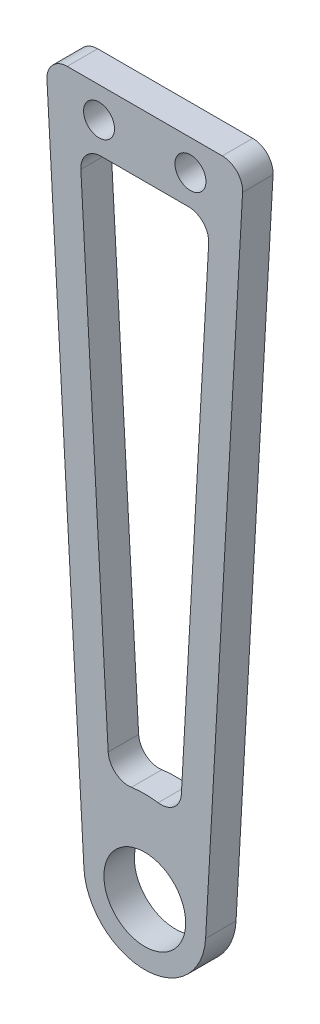
ISO-10303-21;
HEADER;
FILE_DESCRIPTION(('STEP AP214'),'2;1');
FILE_NAME('part.step','',(''),(''),'','','');
FILE_SCHEMA(('AUTOMOTIVE_DESIGN { 1 0 10303 214 1 1 1 1 }'));
ENDSEC;
DATA;
#1=APPLICATION_CONTEXT('core data for automotive mechanical design processes');
#2=APPLICATION_PROTOCOL_DEFINITION('international standard','automotive_design',2000,#1);
#3=PRODUCT_CONTEXT('',#1,'mechanical');
#4=PRODUCT('Part','Part','',(#3));
#5=PRODUCT_RELATED_PRODUCT_CATEGORY('part','',(#4));
#6=PRODUCT_DEFINITION_FORMATION('','',#4);
#7=PRODUCT_DEFINITION_CONTEXT('part definition',#1,'design');
#8=PRODUCT_DEFINITION('design','',#6,#7);
#9=PRODUCT_DEFINITION_SHAPE('','',#8);
#10=(LENGTH_UNIT() NAMED_UNIT(*) SI_UNIT(.MILLI.,.METRE.));
#11=(NAMED_UNIT(*) PLANE_ANGLE_UNIT() SI_UNIT($,.RADIAN.));
#12=(NAMED_UNIT(*) SI_UNIT($,.STERADIAN.) SOLID_ANGLE_UNIT());
#13=UNCERTAINTY_MEASURE_WITH_UNIT(LENGTH_MEASURE(1.E-05),#10,'distance_accuracy_value','');
#14=(GEOMETRIC_REPRESENTATION_CONTEXT(3) GLOBAL_UNCERTAINTY_ASSIGNED_CONTEXT((#13)) GLOBAL_UNIT_ASSIGNED_CONTEXT((#10,
#11,#12)) REPRESENTATION_CONTEXT('',''));
#15=CARTESIAN_POINT('',(0.,0.,0.));
#16=DIRECTION('',(0.,0.,1.));
#17=DIRECTION('',(1.,0.,0.));
#18=AXIS2_PLACEMENT_3D('',#15,#16,#17);
#19=CARTESIAN_POINT('',(7.98764478027175,-0.444444444444444,3.));
#20=DIRECTION('',(0.998455597533968,-0.0555555555555554,0.));
#21=DIRECTION('',(0.0555555555555555,0.998455597533968,0.));
#22=AXIS2_PLACEMENT_3D('',#19,#20,#21);
#23=PLANE('',#22);
#24=DIRECTION('',(-0.0555555555555555,-0.998455597533968,0.));
#25=VECTOR('',#24,1.);
#26=CARTESIAN_POINT('',(7.98764478027175,-0.444444444444444,3.));
#27=LINE('',#26,#25);
#28=CARTESIAN_POINT('',(6.29384167167906,-30.885813952551,3.));
#29=VERTEX_POINT('',#28);
#30=CARTESIAN_POINT('',(3.6039474120521,-79.2291335979336,3.));
#31=VERTEX_POINT('',#30);
#32=EDGE_CURVE('E273',#29,#31,#27,.T.);
#33=ORIENTED_EDGE('',*,*,#32,.F.);
#34=DIRECTION('',(0.,0.,1.));
#35=VECTOR('',#34,1.);
#36=CARTESIAN_POINT('',(6.29384167167906,-30.885813952551,3.));
#37=LINE('',#36,#35);
#38=CARTESIAN_POINT('',(6.29384167167906,-30.885813952551,0.));
#39=VERTEX_POINT('',#38);
#40=EDGE_CURVE('E223',#29,#39,#37,.F.);
#41=ORIENTED_EDGE('',*,*,#40,.T.);
#42=DIRECTION('',(-0.0555555555555555,-0.998455597533968,0.));
#43=VECTOR('',#42,1.);
#44=CARTESIAN_POINT('',(7.98764478027175,-0.444444444444444,0.));
#45=LINE('',#44,#43);
#46=CARTESIAN_POINT('',(3.6039474120521,-79.2291335979336,0.));
#47=VERTEX_POINT('',#46);
#48=EDGE_CURVE('E255',#39,#47,#45,.T.);
#49=ORIENTED_EDGE('',*,*,#48,.T.);
#50=DIRECTION('',(0.,0.,1.));
#51=VECTOR('',#50,1.);
#52=CARTESIAN_POINT('',(3.6039474120521,-79.2291335979336,3.));
#53=LINE('',#52,#51);
#54=EDGE_CURVE('E220',#47,#31,#53,.T.);
#55=ORIENTED_EDGE('',*,*,#54,.T.);
#56=EDGE_LOOP('',(#33,#41,#49,#55));
#57=FACE_BOUND('',#56,.T.);
#58=ADVANCED_FACE('F41',(#57),#23,.F.);
#59=CARTESIAN_POINT('',(-7.98764478027175,-0.444444444444445,3.));
#60=DIRECTION('',(0.998455597533968,0.0555555555555557,0.));
#61=DIRECTION('',(-0.0555555555555557,0.998455597533968,0.));
#62=AXIS2_PLACEMENT_3D('',#59,#60,#61);
#63=PLANE('',#62);
#64=DIRECTION('',(0.0555555555555557,-0.998455597533968,0.));
#65=VECTOR('',#64,1.);
#66=CARTESIAN_POINT('',(-7.98764478027175,-0.444444444444445,0.));
#67=LINE('',#66,#65);
#68=CARTESIAN_POINT('',(-6.29384167167905,-30.885813952551,0.));
#69=VERTEX_POINT('',#68);
#70=CARTESIAN_POINT('',(-3.60394741205208,-79.2291335979336,0.));
#71=VERTEX_POINT('',#70);
#72=EDGE_CURVE('E299',#69,#71,#67,.T.);
#73=ORIENTED_EDGE('',*,*,#72,.F.);
#74=DIRECTION('',(0.,0.,1.));
#75=VECTOR('',#74,1.);
#76=CARTESIAN_POINT('',(-6.29384167167905,-30.885813952551,3.));
#77=LINE('',#76,#75);
#78=CARTESIAN_POINT('',(-6.29384167167905,-30.885813952551,3.));
#79=VERTEX_POINT('',#78);
#80=EDGE_CURVE('E210',#69,#79,#77,.T.);
#81=ORIENTED_EDGE('',*,*,#80,.T.);
#82=DIRECTION('',(0.0555555555555557,-0.998455597533968,0.));
#83=VECTOR('',#82,1.);
#84=CARTESIAN_POINT('',(-7.98764478027175,-0.444444444444445,3.));
#85=LINE('',#84,#83);
#86=CARTESIAN_POINT('',(-3.60394741205208,-79.2291335979336,3.));
#87=VERTEX_POINT('',#86);
#88=EDGE_CURVE('E278',#79,#87,#85,.T.);
#89=ORIENTED_EDGE('',*,*,#88,.T.);
#90=DIRECTION('',(0.,0.,-1.));
#91=VECTOR('',#90,1.);
#92=CARTESIAN_POINT('',(-3.60394741205208,-79.2291335979336,3.));
#93=LINE('',#92,#91);
#94=EDGE_CURVE('E206',#87,#71,#93,.T.);
#95=ORIENTED_EDGE('',*,*,#94,.T.);
#96=EDGE_LOOP('',(#73,#81,#89,#95));
#97=FACE_BOUND('',#96,.T.);
#98=ADVANCED_FACE('F323',(#97),#63,.T.);
#99=CARTESIAN_POINT('',(0.,-90.,3.));
#100=DIRECTION('',(0.,0.,-1.));
#101=DIRECTION('',(-1.,0.,0.));
#102=AXIS2_PLACEMENT_3D('',#99,#100,#101);
#103=CYLINDRICAL_SURFACE('',#102,9.00000000000001);
#104=CARTESIAN_POINT('',(0.,-90.,0.));
#105=DIRECTION('',(0.,0.,1.));
#106=DIRECTION('',(1.,0.,0.));
#107=AXIS2_PLACEMENT_3D('',#104,#105,#106);
#108=CIRCLE('',#107,9.00000000000001);
#109=CARTESIAN_POINT('',(1.31484781389614,-81.0965638528547,0.));
#110=VERTEX_POINT('',#109);
#111=CARTESIAN_POINT('',(-1.31484781389612,-81.0965638528547,0.));
#112=VERTEX_POINT('',#111);
#113=EDGE_CURVE('E258',#110,#112,#108,.T.);
#114=ORIENTED_EDGE('',*,*,#113,.T.);
#115=DIRECTION('',(0.,0.,-1.));
#116=VECTOR('',#115,1.);
#117=CARTESIAN_POINT('',(-1.31484781389612,-81.0965638528547,3.));
#118=LINE('',#117,#116);
#119=CARTESIAN_POINT('',(-1.31484781389612,-81.0965638528547,3.));
#120=VERTEX_POINT('',#119);
#121=EDGE_CURVE('E230',#112,#120,#118,.F.);
#122=ORIENTED_EDGE('',*,*,#121,.T.);
#123=CARTESIAN_POINT('',(0.,-90.,3.));
#124=DIRECTION('',(0.,0.,1.));
#125=DIRECTION('',(1.,0.,0.));
#126=AXIS2_PLACEMENT_3D('',#123,#124,#125);
#127=CIRCLE('',#126,9.00000000000001);
#128=CARTESIAN_POINT('',(1.31484781389614,-81.0965638528547,3.));
#129=VERTEX_POINT('',#128);
#130=EDGE_CURVE('E272',#129,#120,#127,.T.);
#131=ORIENTED_EDGE('',*,*,#130,.F.);
#132=DIRECTION('',(0.,0.,-1.));
#133=VECTOR('',#132,1.);
#134=CARTESIAN_POINT('',(1.31484781389614,-81.0965638528547,3.));
#135=LINE('',#134,#133);
#136=EDGE_CURVE('E226',#129,#110,#135,.T.);
#137=ORIENTED_EDGE('',*,*,#136,.T.);
#138=EDGE_LOOP('',(#114,#122,#131,#137));
#139=FACE_BOUND('',#138,.T.);
#140=ADVANCED_FACE('F275',(#139),#103,.T.);
#141=CARTESIAN_POINT('',(-10.9830115728737,-0.611111111111113,3.));
#142=DIRECTION('',(0.998455597533968,0.0555555555555557,0.));
#143=DIRECTION('',(-0.0555555555555557,0.998455597533968,0.));
#144=AXIS2_PLACEMENT_3D('',#141,#142,#143);
#145=PLANE('',#144);
#146=DIRECTION('',(0.0555555555555557,-0.998455597533968,0.));
#147=VECTOR('',#146,1.);
#148=CARTESIAN_POINT('',(-10.9830115728737,-0.611111111111113,3.));
#149=LINE('',#148,#147);
#150=CARTESIAN_POINT('',(-9.632330976127,-24.885813952551,3.));
#151=VERTEX_POINT('',#150);
#152=CARTESIAN_POINT('',(-5.9907335852038,-90.3333333333333,3.));
#153=VERTEX_POINT('',#152);
#154=EDGE_CURVE('E145',#151,#153,#149,.T.);
#155=ORIENTED_EDGE('',*,*,#154,.F.);
#156=DIRECTION('',(0.,0.,-1.));
#157=VECTOR('',#156,1.);
#158=CARTESIAN_POINT('',(-9.632330976127,-24.885813952551,0.));
#159=LINE('',#158,#157);
#160=CARTESIAN_POINT('',(-9.632330976127,-24.885813952551,0.));
#161=VERTEX_POINT('',#160);
#162=EDGE_CURVE('E203',#151,#161,#159,.T.);
#163=ORIENTED_EDGE('',*,*,#162,.T.);
#164=DIRECTION('',(0.0555555555555557,-0.998455597533968,0.));
#165=VECTOR('',#164,1.);
#166=CARTESIAN_POINT('',(-10.9830115728737,-0.611111111111113,0.));
#167=LINE('',#166,#165);
#168=CARTESIAN_POINT('',(-5.9907335852038,-90.3333333333333,0.));
#169=VERTEX_POINT('',#168);
#170=EDGE_CURVE('E173',#161,#169,#167,.T.);
#171=ORIENTED_EDGE('',*,*,#170,.T.);
#172=DIRECTION('',(0.,0.,-1.));
#173=VECTOR('',#172,1.);
#174=CARTESIAN_POINT('',(-5.9907335852038,-90.3333333333333,3.));
#175=LINE('',#174,#173);
#176=EDGE_CURVE('E165',#153,#169,#175,.T.);
#177=ORIENTED_EDGE('',*,*,#176,.F.);
#178=EDGE_LOOP('',(#155,#163,#171,#177));
#179=FACE_BOUND('',#178,.T.);
#180=ADVANCED_FACE('F171',(#179),#145,.F.);
#181=CARTESIAN_POINT('',(0.,-90.,3.));
#182=DIRECTION('',(0.,0.,-1.));
#183=DIRECTION('',(-1.,0.,0.));
#184=AXIS2_PLACEMENT_3D('',#181,#182,#183);
#185=CYLINDRICAL_SURFACE('',#184,6.);
#186=CARTESIAN_POINT('',(0.,-90.,0.));
#187=DIRECTION('',(0.,0.,1.));
#188=DIRECTION('',(1.,0.,0.));
#189=AXIS2_PLACEMENT_3D('',#186,#187,#188);
#190=CIRCLE('',#189,6.);
#191=CARTESIAN_POINT('',(5.99073358520382,-90.3333333333333,0.));
#192=VERTEX_POINT('',#191);
#193=EDGE_CURVE('E291',#169,#192,#190,.T.);
#194=ORIENTED_EDGE('',*,*,#193,.T.);
#195=DIRECTION('',(0.,0.,-1.));
#196=VECTOR('',#195,1.);
#197=CARTESIAN_POINT('',(5.99073358520382,-90.3333333333333,3.));
#198=LINE('',#197,#196);
#199=CARTESIAN_POINT('',(5.99073358520382,-90.3333333333333,3.));
#200=VERTEX_POINT('',#199);
#201=EDGE_CURVE('E167',#200,#192,#198,.T.);
#202=ORIENTED_EDGE('',*,*,#201,.F.);
#203=CARTESIAN_POINT('',(0.,-90.,3.));
#204=DIRECTION('',(0.,0.,1.));
#205=DIRECTION('',(1.,0.,0.));
#206=AXIS2_PLACEMENT_3D('',#203,#204,#205);
#207=CIRCLE('',#206,6.);
#208=EDGE_CURVE('E149',#153,#200,#207,.T.);
#209=ORIENTED_EDGE('',*,*,#208,.F.);
#210=ORIENTED_EDGE('',*,*,#176,.T.);
#211=EDGE_LOOP('',(#194,#202,#209,#210));
#212=FACE_BOUND('',#211,.T.);
#213=ADVANCED_FACE('F164',(#212),#185,.T.);
#214=CARTESIAN_POINT('',(10.9830115728737,-0.61111111111111,3.));
#215=DIRECTION('',(0.998455597533968,-0.0555555555555555,0.));
#216=DIRECTION('',(0.0555555555555555,0.998455597533968,0.));
#217=AXIS2_PLACEMENT_3D('',#214,#215,#216);
#218=PLANE('',#217);
#219=DIRECTION('',(-0.0555555555555555,-0.998455597533968,0.));
#220=VECTOR('',#219,1.);
#221=CARTESIAN_POINT('',(10.9830115728737,-0.61111111111111,0.));
#222=LINE('',#221,#220);
#223=CARTESIAN_POINT('',(9.632330976127,-24.885813952551,0.));
#224=VERTEX_POINT('',#223);
#225=EDGE_CURVE('E267',#224,#192,#222,.T.);
#226=ORIENTED_EDGE('',*,*,#225,.F.);
#227=DIRECTION('',(0.,0.,-1.));
#228=VECTOR('',#227,1.);
#229=CARTESIAN_POINT('',(9.632330976127,-24.885813952551,3.));
#230=LINE('',#229,#228);
#231=CARTESIAN_POINT('',(9.632330976127,-24.885813952551,3.));
#232=VERTEX_POINT('',#231);
#233=EDGE_CURVE('E195',#224,#232,#230,.F.);
#234=ORIENTED_EDGE('',*,*,#233,.T.);
#235=DIRECTION('',(-0.0555555555555555,-0.998455597533968,0.));
#236=VECTOR('',#235,1.);
#237=CARTESIAN_POINT('',(10.9830115728737,-0.61111111111111,3.));
#238=LINE('',#237,#236);
#239=EDGE_CURVE('E169',#232,#200,#238,.T.);
#240=ORIENTED_EDGE('',*,*,#239,.T.);
#241=ORIENTED_EDGE('',*,*,#201,.T.);
#242=EDGE_LOOP('',(#226,#234,#240,#241));
#243=FACE_BOUND('',#242,.T.);
#244=ADVANCED_FACE('F310',(#243),#218,.T.);
#245=CARTESIAN_POINT('',(0.,-90.,3.));
#246=DIRECTION('',(0.,0.,-1.));
#247=DIRECTION('',(-1.,0.,0.));
#248=AXIS2_PLACEMENT_3D('',#245,#246,#247);
#249=CYLINDRICAL_SURFACE('',#248,4.025);
#250=CARTESIAN_POINT('',(0.,-90.,3.));
#251=DIRECTION('',(0.,0.,1.));
#252=DIRECTION('',(1.,0.,0.));
#253=AXIS2_PLACEMENT_3D('',#250,#251,#252);
#254=CIRCLE('',#253,4.025);
#255=CARTESIAN_POINT('',(4.02500000000001,-90.,3.));
#256=VERTEX_POINT('',#255);
#257=EDGE_CURVE('E182',#256,#256,#254,.T.);
#258=ORIENTED_EDGE('',*,*,#257,.T.);
#259=EDGE_LOOP('',(#258));
#260=FACE_BOUND('',#259,.T.);
#261=CARTESIAN_POINT('',(0.,-90.,0.));
#262=DIRECTION('',(0.,0.,1.));
#263=DIRECTION('',(1.,0.,0.));
#264=AXIS2_PLACEMENT_3D('',#261,#262,#263);
#265=CIRCLE('',#264,4.025);
#266=CARTESIAN_POINT('',(4.02500000000001,-90.,0.));
#267=VERTEX_POINT('',#266);
#268=EDGE_CURVE('E159',#267,#267,#265,.T.);
#269=ORIENTED_EDGE('',*,*,#268,.F.);
#270=EDGE_LOOP('',(#269));
#271=FACE_BOUND('',#270,.T.);
#272=ADVANCED_FACE('F308',(#260,#271),#249,.F.);
#273=CARTESIAN_POINT('',(0.,0.,3.));
#274=DIRECTION('',(0.,0.,1.));
#275=DIRECTION('',(1.,0.,0.));
#276=AXIS2_PLACEMENT_3D('',#273,#274,#275);
#277=PLANE('',#276);
#278=ORIENTED_EDGE('',*,*,#239,.F.);
#279=CARTESIAN_POINT('',(7.63541978105906,-24.7747028414399,3.));
#280=DIRECTION('',(0.,0.,1.));
#281=DIRECTION('',(1.,0.,0.));
#282=AXIS2_PLACEMENT_3D('',#279,#280,#281);
#283=CIRCLE('',#282,2.);
#284=CARTESIAN_POINT('',(7.63541978105906,-22.7747028414399,3.));
#285=VERTEX_POINT('',#284);
#286=EDGE_CURVE('E200',#232,#285,#283,.T.);
#287=ORIENTED_EDGE('',*,*,#286,.T.);
#288=DIRECTION('',(-1.,0.,0.));
#289=VECTOR('',#288,1.);
#290=CARTESIAN_POINT('',(-6.7451559665396,-22.7747028414399,3.));
#291=LINE('',#290,#289);
#292=CARTESIAN_POINT('',(-7.63541978105906,-22.7747028414399,3.));
#293=VERTEX_POINT('',#292);
#294=EDGE_CURVE('E369',#285,#293,#291,.T.);
#295=ORIENTED_EDGE('',*,*,#294,.T.);
#296=CARTESIAN_POINT('',(-7.63541978105906,-24.7747028414399,3.));
#297=DIRECTION('',(0.,0.,1.));
#298=DIRECTION('',(1.,0.,0.));
#299=AXIS2_PLACEMENT_3D('',#296,#297,#298);
#300=CIRCLE('',#299,2.);
#301=EDGE_CURVE('E153',#293,#151,#300,.T.);
#302=ORIENTED_EDGE('',*,*,#301,.T.);
#303=ORIENTED_EDGE('',*,*,#154,.T.);
#304=ORIENTED_EDGE('',*,*,#208,.T.);
#305=EDGE_LOOP('',(#278,#287,#295,#302,#303,#304));
#306=FACE_BOUND('',#305,.T.);
#307=ORIENTED_EDGE('',*,*,#88,.F.);
#308=CARTESIAN_POINT('',(-4.29693047661111,-30.7747028414399,3.));
#309=DIRECTION('',(0.,0.,1.));
#310=DIRECTION('',(1.,0.,0.));
#311=AXIS2_PLACEMENT_3D('',#308,#309,#310);
#312=CIRCLE('',#311,2.);
#313=CARTESIAN_POINT('',(-4.29693047661111,-28.7747028414399,3.));
#314=VERTEX_POINT('',#313);
#315=EDGE_CURVE('E65',#79,#314,#312,.F.);
#316=ORIENTED_EDGE('',*,*,#315,.T.);
#317=DIRECTION('',(1.,0.,0.));
#318=VECTOR('',#317,1.);
#319=CARTESIAN_POINT('',(-6.41130703609481,-28.7747028414399,3.));
#320=LINE('',#319,#318);
#321=CARTESIAN_POINT('',(4.29693047661112,-28.7747028414399,3.));
#322=VERTEX_POINT('',#321);
#323=EDGE_CURVE('E364',#314,#322,#320,.T.);
#324=ORIENTED_EDGE('',*,*,#323,.T.);
#325=CARTESIAN_POINT('',(4.29693047661112,-30.7747028414399,3.));
#326=DIRECTION('',(0.,0.,1.));
#327=DIRECTION('',(1.,0.,0.));
#328=AXIS2_PLACEMENT_3D('',#325,#326,#327);
#329=CIRCLE('',#328,2.);
#330=EDGE_CURVE('E238',#322,#29,#329,.F.);
#331=ORIENTED_EDGE('',*,*,#330,.T.);
#332=ORIENTED_EDGE('',*,*,#32,.T.);
#333=CARTESIAN_POINT('',(1.60703621698416,-79.1180224868225,3.));
#334=DIRECTION('',(0.,0.,1.));
#335=DIRECTION('',(1.,0.,0.));
#336=AXIS2_PLACEMENT_3D('',#333,#334,#335);
#337=CIRCLE('',#336,2.);
#338=EDGE_CURVE('E11',#31,#129,#337,.F.);
#339=ORIENTED_EDGE('',*,*,#338,.T.);
#340=ORIENTED_EDGE('',*,*,#130,.T.);
#341=CARTESIAN_POINT('',(-1.60703621698414,-79.1180224868225,3.));
#342=DIRECTION('',(0.,0.,1.));
#343=DIRECTION('',(1.,0.,0.));
#344=AXIS2_PLACEMENT_3D('',#341,#342,#343);
#345=CIRCLE('',#344,2.);
#346=EDGE_CURVE('E57',#120,#87,#345,.F.);
#347=ORIENTED_EDGE('',*,*,#346,.T.);
#348=EDGE_LOOP('',(#307,#316,#324,#331,#332,#339,#340,#347));
#349=FACE_BOUND('',#348,.T.);
#350=ORIENTED_EDGE('',*,*,#257,.F.);
#351=EDGE_LOOP('',(#350));
#352=FACE_BOUND('',#351,.T.);
#353=CARTESIAN_POINT('',(4.5,-25.7747028414399,3.));
#354=DIRECTION('',(0.,0.,1.));
#355=DIRECTION('',(-1.,0.,0.));
#356=AXIS2_PLACEMENT_3D('',#353,#354,#355);
#357=CIRCLE('',#356,1.525);
#358=CARTESIAN_POINT('',(2.97500000000001,-25.7747028414399,3.));
#359=VERTEX_POINT('',#358);
#360=EDGE_CURVE('E377',#359,#359,#357,.T.);
#361=ORIENTED_EDGE('',*,*,#360,.F.);
#362=EDGE_LOOP('',(#361));
#363=FACE_BOUND('',#362,.T.);
#364=CARTESIAN_POINT('',(-4.5,-25.7747028414399,3.));
#365=DIRECTION('',(0.,0.,1.));
#366=DIRECTION('',(1.,0.,0.));
#367=AXIS2_PLACEMENT_3D('',#364,#365,#366);
#368=CIRCLE('',#367,1.525);
#369=CARTESIAN_POINT('',(-2.975,-25.7747028414399,3.));
#370=VERTEX_POINT('',#369);
#371=EDGE_CURVE('E370',#370,#370,#368,.T.);
#372=ORIENTED_EDGE('',*,*,#371,.F.);
#373=EDGE_LOOP('',(#372));
#374=FACE_BOUND('',#373,.T.);
#375=ADVANCED_FACE('F148',(#306,#349,#352,#363,#374),#277,.T.);
#376=CARTESIAN_POINT('',(0.,0.,0.));
#377=DIRECTION('',(0.,0.,1.));
#378=DIRECTION('',(1.,0.,0.));
#379=AXIS2_PLACEMENT_3D('',#376,#377,#378);
#380=PLANE('',#379);
#381=ORIENTED_EDGE('',*,*,#48,.F.);
#382=CARTESIAN_POINT('',(4.29693047661112,-30.7747028414399,0.));
#383=DIRECTION('',(0.,0.,1.));
#384=DIRECTION('',(1.,0.,0.));
#385=AXIS2_PLACEMENT_3D('',#382,#383,#384);
#386=CIRCLE('',#385,2.);
#387=CARTESIAN_POINT('',(4.29693047661112,-28.7747028414399,0.));
#388=VERTEX_POINT('',#387);
#389=EDGE_CURVE('E241',#39,#388,#386,.T.);
#390=ORIENTED_EDGE('',*,*,#389,.T.);
#391=DIRECTION('',(-1.,0.,0.));
#392=VECTOR('',#391,1.);
#393=CARTESIAN_POINT('',(-6.41130703609481,-28.7747028414399,0.));
#394=LINE('',#393,#392);
#395=CARTESIAN_POINT('',(-4.29693047661111,-28.7747028414399,0.));
#396=VERTEX_POINT('',#395);
#397=EDGE_CURVE('E361',#388,#396,#394,.T.);
#398=ORIENTED_EDGE('',*,*,#397,.T.);
#399=CARTESIAN_POINT('',(-4.29693047661111,-30.7747028414399,0.));
#400=DIRECTION('',(0.,0.,1.));
#401=DIRECTION('',(1.,0.,0.));
#402=AXIS2_PLACEMENT_3D('',#399,#400,#401);
#403=CIRCLE('',#402,2.);
#404=EDGE_CURVE('E235',#396,#69,#403,.T.);
#405=ORIENTED_EDGE('',*,*,#404,.T.);
#406=ORIENTED_EDGE('',*,*,#72,.T.);
#407=CARTESIAN_POINT('',(-1.60703621698414,-79.1180224868225,0.));
#408=DIRECTION('',(0.,0.,1.));
#409=DIRECTION('',(1.,0.,0.));
#410=AXIS2_PLACEMENT_3D('',#407,#408,#409);
#411=CIRCLE('',#410,2.);
#412=EDGE_CURVE('E244',#71,#112,#411,.T.);
#413=ORIENTED_EDGE('',*,*,#412,.T.);
#414=ORIENTED_EDGE('',*,*,#113,.F.);
#415=CARTESIAN_POINT('',(1.60703621698416,-79.1180224868225,0.));
#416=DIRECTION('',(0.,0.,1.));
#417=DIRECTION('',(1.,0.,0.));
#418=AXIS2_PLACEMENT_3D('',#415,#416,#417);
#419=CIRCLE('',#418,2.);
#420=EDGE_CURVE('E50',#110,#47,#419,.T.);
#421=ORIENTED_EDGE('',*,*,#420,.T.);
#422=EDGE_LOOP('',(#381,#390,#398,#405,#406,#413,#414,#421));
#423=FACE_BOUND('',#422,.T.);
#424=DIRECTION('',(1.,0.,0.));
#425=VECTOR('',#424,1.);
#426=CARTESIAN_POINT('',(-6.7451559665396,-22.7747028414399,0.));
#427=LINE('',#426,#425);
#428=CARTESIAN_POINT('',(-7.63541978105906,-22.7747028414399,0.));
#429=VERTEX_POINT('',#428);
#430=CARTESIAN_POINT('',(7.63541978105906,-22.7747028414399,0.));
#431=VERTEX_POINT('',#430);
#432=EDGE_CURVE('E374',#429,#431,#427,.T.);
#433=ORIENTED_EDGE('',*,*,#432,.T.);
#434=CARTESIAN_POINT('',(7.63541978105906,-24.7747028414399,0.));
#435=DIRECTION('',(0.,0.,1.));
#436=DIRECTION('',(1.,0.,0.));
#437=AXIS2_PLACEMENT_3D('',#434,#435,#436);
#438=CIRCLE('',#437,2.);
#439=EDGE_CURVE('E192',#431,#224,#438,.F.);
#440=ORIENTED_EDGE('',*,*,#439,.T.);
#441=ORIENTED_EDGE('',*,*,#225,.T.);
#442=ORIENTED_EDGE('',*,*,#193,.F.);
#443=ORIENTED_EDGE('',*,*,#170,.F.);
#444=CARTESIAN_POINT('',(-7.63541978105906,-24.7747028414399,0.));
#445=DIRECTION('',(0.,0.,1.));
#446=DIRECTION('',(1.,0.,0.));
#447=AXIS2_PLACEMENT_3D('',#444,#445,#446);
#448=CIRCLE('',#447,2.);
#449=EDGE_CURVE('E189',#161,#429,#448,.F.);
#450=ORIENTED_EDGE('',*,*,#449,.T.);
#451=EDGE_LOOP('',(#433,#440,#441,#442,#443,#450));
#452=FACE_BOUND('',#451,.T.);
#453=ORIENTED_EDGE('',*,*,#268,.T.);
#454=EDGE_LOOP('',(#453));
#455=FACE_BOUND('',#454,.T.);
#456=CARTESIAN_POINT('',(4.5,-25.7747028414399,0.));
#457=DIRECTION('',(0.,0.,1.));
#458=DIRECTION('',(1.,0.,0.));
#459=AXIS2_PLACEMENT_3D('',#456,#457,#458);
#460=CIRCLE('',#459,1.525);
#461=CARTESIAN_POINT('',(6.025,-25.7747028414399,0.));
#462=VERTEX_POINT('',#461);
#463=EDGE_CURVE('E381',#462,#462,#460,.F.);
#464=ORIENTED_EDGE('',*,*,#463,.F.);
#465=EDGE_LOOP('',(#464));
#466=FACE_BOUND('',#465,.T.);
#467=CARTESIAN_POINT('',(-4.5,-25.7747028414399,0.));
#468=DIRECTION('',(0.,0.,1.));
#469=DIRECTION('',(1.,0.,0.));
#470=AXIS2_PLACEMENT_3D('',#467,#468,#469);
#471=CIRCLE('',#470,1.525);
#472=CARTESIAN_POINT('',(-2.975,-25.7747028414399,0.));
#473=VERTEX_POINT('',#472);
#474=EDGE_CURVE('E292',#473,#473,#471,.F.);
#475=ORIENTED_EDGE('',*,*,#474,.F.);
#476=EDGE_LOOP('',(#475));
#477=FACE_BOUND('',#476,.T.);
#478=ADVANCED_FACE('F253',(#423,#452,#455,#466,#477),#380,.F.);
#479=CARTESIAN_POINT('',(-6.41130703609481,-28.7747028414399,-14.7644341595531));
#480=DIRECTION('',(0.,-1.,0.));
#481=DIRECTION('',(0.,0.,-1.));
#482=AXIS2_PLACEMENT_3D('',#479,#480,#481);
#483=PLANE('',#482);
#484=ORIENTED_EDGE('',*,*,#323,.F.);
#485=DIRECTION('',(0.,0.,1.));
#486=VECTOR('',#485,1.);
#487=CARTESIAN_POINT('',(-4.29693047661111,-28.7747028414399,0.));
#488=LINE('',#487,#486);
#489=EDGE_CURVE('E217',#314,#396,#488,.F.);
#490=ORIENTED_EDGE('',*,*,#489,.T.);
#491=ORIENTED_EDGE('',*,*,#397,.F.);
#492=DIRECTION('',(0.,0.,1.));
#493=VECTOR('',#492,1.);
#494=CARTESIAN_POINT('',(4.29693047661112,-28.7747028414399,-14.7644341595531));
#495=LINE('',#494,#493);
#496=EDGE_CURVE('E213',#388,#322,#495,.T.);
#497=ORIENTED_EDGE('',*,*,#496,.T.);
#498=EDGE_LOOP('',(#484,#490,#491,#497));
#499=FACE_BOUND('',#498,.T.);
#500=ADVANCED_FACE('F366',(#499),#483,.T.);
#501=CARTESIAN_POINT('',(-6.7451559665396,-22.7747028414399,-14.7644341595531));
#502=DIRECTION('',(0.,1.,0.));
#503=DIRECTION('',(0.,0.,1.));
#504=AXIS2_PLACEMENT_3D('',#501,#502,#503);
#505=PLANE('',#504);
#506=ORIENTED_EDGE('',*,*,#294,.F.);
#507=DIRECTION('',(0.,0.,-1.));
#508=VECTOR('',#507,1.);
#509=CARTESIAN_POINT('',(7.63541978105906,-22.7747028414399,-14.7644341595531));
#510=LINE('',#509,#508);
#511=EDGE_CURVE('E180',#285,#431,#510,.T.);
#512=ORIENTED_EDGE('',*,*,#511,.T.);
#513=ORIENTED_EDGE('',*,*,#432,.F.);
#514=DIRECTION('',(0.,0.,-1.));
#515=VECTOR('',#514,1.);
#516=CARTESIAN_POINT('',(-7.63541978105906,-22.7747028414399,3.));
#517=LINE('',#516,#515);
#518=EDGE_CURVE('E176',#429,#293,#517,.F.);
#519=ORIENTED_EDGE('',*,*,#518,.T.);
#520=EDGE_LOOP('',(#506,#512,#513,#519));
#521=FACE_BOUND('',#520,.T.);
#522=ADVANCED_FACE('F393',(#521),#505,.T.);
#523=CARTESIAN_POINT('',(-4.5,-25.7747028414399,-14.7644341595531));
#524=DIRECTION('',(0.,0.,1.));
#525=DIRECTION('',(1.,0.,0.));
#526=AXIS2_PLACEMENT_3D('',#523,#524,#525);
#527=CYLINDRICAL_SURFACE('',#526,1.525);
#528=ORIENTED_EDGE('',*,*,#474,.T.);
#529=EDGE_LOOP('',(#528));
#530=FACE_BOUND('',#529,.T.);
#531=ORIENTED_EDGE('',*,*,#371,.T.);
#532=EDGE_LOOP('',(#531));
#533=FACE_BOUND('',#532,.T.);
#534=ADVANCED_FACE('F408',(#530,#533),#527,.F.);
#535=CARTESIAN_POINT('',(4.5,-25.7747028414399,-14.7644341595531));
#536=DIRECTION('',(0.,0.,1.));
#537=DIRECTION('',(1.,0.,0.));
#538=AXIS2_PLACEMENT_3D('',#535,#536,#537);
#539=CYLINDRICAL_SURFACE('',#538,1.525);
#540=ORIENTED_EDGE('',*,*,#463,.T.);
#541=EDGE_LOOP('',(#540));
#542=FACE_BOUND('',#541,.T.);
#543=ORIENTED_EDGE('',*,*,#360,.T.);
#544=EDGE_LOOP('',(#543));
#545=FACE_BOUND('',#544,.T.);
#546=ADVANCED_FACE('F339',(#542,#545),#539,.F.);
#547=CARTESIAN_POINT('',(7.63541978105906,-24.7747028414399,-14.7644341595531));
#548=DIRECTION('',(0.,0.,-1.));
#549=DIRECTION('',(-1.,0.,0.));
#550=AXIS2_PLACEMENT_3D('',#547,#548,#549);
#551=CYLINDRICAL_SURFACE('',#550,2.);
#552=ORIENTED_EDGE('',*,*,#286,.F.);
#553=ORIENTED_EDGE('',*,*,#233,.F.);
#554=ORIENTED_EDGE('',*,*,#439,.F.);
#555=ORIENTED_EDGE('',*,*,#511,.F.);
#556=EDGE_LOOP('',(#552,#553,#554,#555));
#557=FACE_BOUND('',#556,.T.);
#558=ADVANCED_FACE('F335',(#557),#551,.T.);
#559=CARTESIAN_POINT('',(-7.63541978105906,-24.7747028414399,3.));
#560=DIRECTION('',(0.,0.,1.));
#561=DIRECTION('',(1.,0.,0.));
#562=AXIS2_PLACEMENT_3D('',#559,#560,#561);
#563=CYLINDRICAL_SURFACE('',#562,2.);
#564=ORIENTED_EDGE('',*,*,#301,.F.);
#565=ORIENTED_EDGE('',*,*,#518,.F.);
#566=ORIENTED_EDGE('',*,*,#449,.F.);
#567=ORIENTED_EDGE('',*,*,#162,.F.);
#568=EDGE_LOOP('',(#564,#565,#566,#567));
#569=FACE_BOUND('',#568,.T.);
#570=ADVANCED_FACE('F338',(#569),#563,.T.);
#571=CARTESIAN_POINT('',(-4.29693047661111,-30.7747028414399,3.));
#572=DIRECTION('',(0.,0.,-1.));
#573=DIRECTION('',(-1.,0.,0.));
#574=AXIS2_PLACEMENT_3D('',#571,#572,#573);
#575=CYLINDRICAL_SURFACE('',#574,2.);
#576=ORIENTED_EDGE('',*,*,#404,.F.);
#577=ORIENTED_EDGE('',*,*,#489,.F.);
#578=ORIENTED_EDGE('',*,*,#315,.F.);
#579=ORIENTED_EDGE('',*,*,#80,.F.);
#580=EDGE_LOOP('',(#576,#577,#578,#579));
#581=FACE_BOUND('',#580,.T.);
#582=ADVANCED_FACE('F343',(#581),#575,.F.);
#583=CARTESIAN_POINT('',(4.29693047661112,-30.7747028414399,-14.7644341595531));
#584=DIRECTION('',(0.,0.,1.));
#585=DIRECTION('',(1.,0.,0.));
#586=AXIS2_PLACEMENT_3D('',#583,#584,#585);
#587=CYLINDRICAL_SURFACE('',#586,2.);
#588=ORIENTED_EDGE('',*,*,#389,.F.);
#589=ORIENTED_EDGE('',*,*,#40,.F.);
#590=ORIENTED_EDGE('',*,*,#330,.F.);
#591=ORIENTED_EDGE('',*,*,#496,.F.);
#592=EDGE_LOOP('',(#588,#589,#590,#591));
#593=FACE_BOUND('',#592,.T.);
#594=ADVANCED_FACE('F347',(#593),#587,.F.);
#595=CARTESIAN_POINT('',(-1.60703621698414,-79.1180224868225,3.));
#596=DIRECTION('',(0.,0.,-1.));
#597=DIRECTION('',(-1.,0.,0.));
#598=AXIS2_PLACEMENT_3D('',#595,#596,#597);
#599=CYLINDRICAL_SURFACE('',#598,2.);
#600=ORIENTED_EDGE('',*,*,#346,.F.);
#601=ORIENTED_EDGE('',*,*,#121,.F.);
#602=ORIENTED_EDGE('',*,*,#412,.F.);
#603=ORIENTED_EDGE('',*,*,#94,.F.);
#604=EDGE_LOOP('',(#600,#601,#602,#603));
#605=FACE_BOUND('',#604,.T.);
#606=ADVANCED_FACE('F349',(#605),#599,.F.);
#607=CARTESIAN_POINT('',(1.60703621698416,-79.1180224868225,3.));
#608=DIRECTION('',(0.,0.,-1.));
#609=DIRECTION('',(-1.,0.,0.));
#610=AXIS2_PLACEMENT_3D('',#607,#608,#609);
#611=CYLINDRICAL_SURFACE('',#610,2.);
#612=ORIENTED_EDGE('',*,*,#338,.F.);
#613=ORIENTED_EDGE('',*,*,#54,.F.);
#614=ORIENTED_EDGE('',*,*,#420,.F.);
#615=ORIENTED_EDGE('',*,*,#136,.F.);
#616=EDGE_LOOP('',(#612,#613,#614,#615));
#617=FACE_BOUND('',#616,.T.);
#618=ADVANCED_FACE('F43',(#617),#611,.F.);
#619=CLOSED_SHELL('',(#58,#98,#140,#180,#213,#244,#272,#375,#478,#500,#522,#534,#546,#558,#570,
#582,#594,#606,#618));
#620=MANIFOLD_SOLID_BREP('B2',#619);
#621=ADVANCED_BREP_SHAPE_REPRESENTATION('',(#18,#620),#14);
#622=SHAPE_DEFINITION_REPRESENTATION(#9,#621);
ENDSEC;
END-ISO-10303-21;
